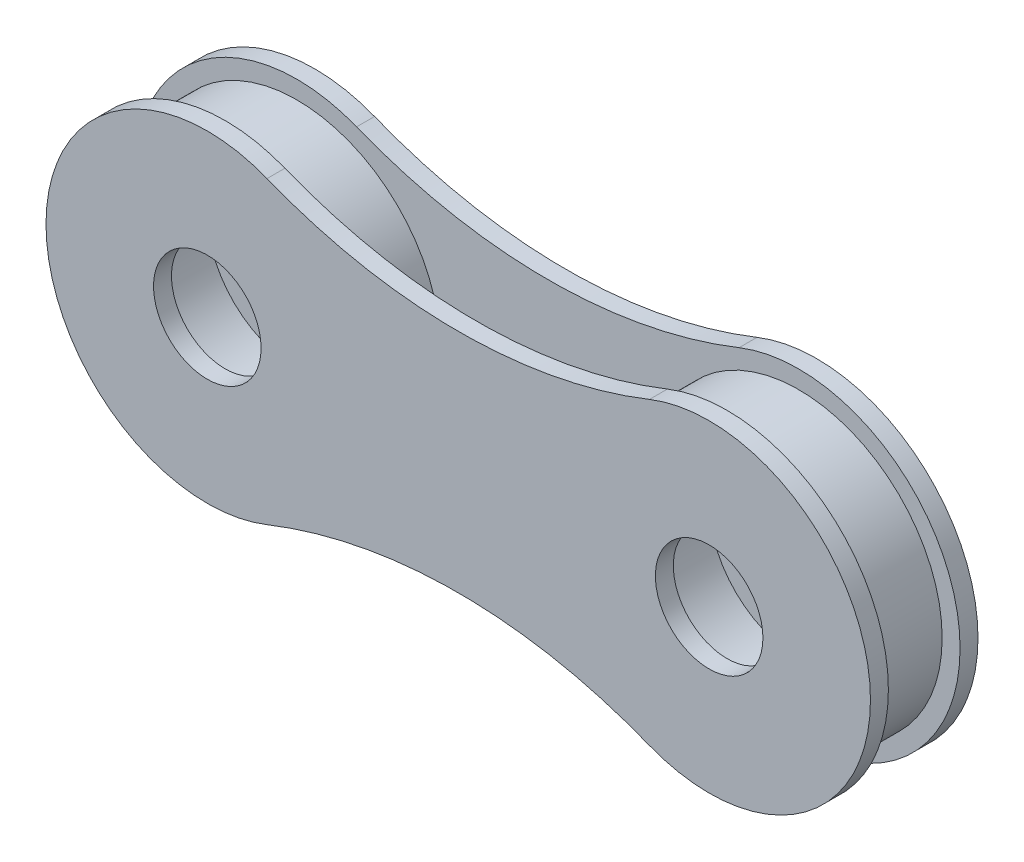
ISO-10303-21;
HEADER;
FILE_DESCRIPTION(('STEP AP214'),'2;1');
FILE_NAME('part.step','',(''),(''),'','','');
FILE_SCHEMA(('AUTOMOTIVE_DESIGN { 1 0 10303 214 1 1 1 1 }'));
ENDSEC;
DATA;
#1=APPLICATION_CONTEXT('core data for automotive mechanical design processes');
#2=APPLICATION_PROTOCOL_DEFINITION('international standard','automotive_design',2000,#1);
#3=PRODUCT_CONTEXT('',#1,'mechanical');
#4=PRODUCT('Part','Part','',(#3));
#5=PRODUCT_RELATED_PRODUCT_CATEGORY('part','',(#4));
#6=PRODUCT_DEFINITION_FORMATION('','',#4);
#7=PRODUCT_DEFINITION_CONTEXT('part definition',#1,'design');
#8=PRODUCT_DEFINITION('design','',#6,#7);
#9=PRODUCT_DEFINITION_SHAPE('','',#8);
#10=(LENGTH_UNIT() NAMED_UNIT(*) SI_UNIT(.MILLI.,.METRE.));
#11=(NAMED_UNIT(*) PLANE_ANGLE_UNIT() SI_UNIT($,.RADIAN.));
#12=(NAMED_UNIT(*) SI_UNIT($,.STERADIAN.) SOLID_ANGLE_UNIT());
#13=UNCERTAINTY_MEASURE_WITH_UNIT(LENGTH_MEASURE(1.E-05),#10,'distance_accuracy_value','');
#14=(GEOMETRIC_REPRESENTATION_CONTEXT(3) GLOBAL_UNCERTAINTY_ASSIGNED_CONTEXT((#13)) GLOBAL_UNIT_ASSIGNED_CONTEXT((#10,
#11,#12)) REPRESENTATION_CONTEXT('',''));
#15=CARTESIAN_POINT('',(0.,0.,0.));
#16=DIRECTION('',(0.,0.,1.));
#17=DIRECTION('',(1.,0.,0.));
#18=AXIS2_PLACEMENT_3D('',#15,#16,#17);
#19=CARTESIAN_POINT('',(-10.4421147734021,0.,1.));
#20=DIRECTION('',(0.,0.,-1.));
#21=DIRECTION('',(-1.,0.,0.));
#22=AXIS2_PLACEMENT_3D('',#19,#20,#21);
#23=CYLINDRICAL_SURFACE('',#22,4.);
#24=CARTESIAN_POINT('',(-10.4421147734021,0.,1.));
#25=DIRECTION('',(0.,0.,1.));
#26=DIRECTION('',(1.,0.,0.));
#27=AXIS2_PLACEMENT_3D('',#24,#25,#26);
#28=CIRCLE('',#27,4.);
#29=CARTESIAN_POINT('',(-6.44211477340213,0.,1.));
#30=VERTEX_POINT('',#29);
#31=EDGE_CURVE('E49',#30,#30,#28,.T.);
#32=ORIENTED_EDGE('',*,*,#31,.F.);
#33=EDGE_LOOP('',(#32));
#34=FACE_BOUND('',#33,.T.);
#35=CARTESIAN_POINT('',(-10.4421147734021,0.,-1.));
#36=DIRECTION('',(0.,0.,1.));
#37=DIRECTION('',(1.,0.,0.));
#38=AXIS2_PLACEMENT_3D('',#35,#36,#37);
#39=CIRCLE('',#38,4.);
#40=CARTESIAN_POINT('',(-6.44211477340213,0.,-1.));
#41=VERTEX_POINT('',#40);
#42=EDGE_CURVE('E183',#41,#41,#39,.T.);
#43=ORIENTED_EDGE('',*,*,#42,.T.);
#44=EDGE_LOOP('',(#43));
#45=FACE_BOUND('',#44,.T.);
#46=ADVANCED_FACE('F39',(#34,#45),#23,.T.);
#47=CARTESIAN_POINT('',(-3.44211477340213,17.5771390566533,1.5));
#48=DIRECTION('',(0.,0.,-1.));
#49=DIRECTION('',(-1.,0.,0.));
#50=AXIS2_PLACEMENT_3D('',#47,#48,#49);
#51=CYLINDRICAL_SURFACE('',#50,14.4197203313613);
#52=CARTESIAN_POINT('',(-3.44211477340213,17.5771390566533,1.));
#53=DIRECTION('',(0.,0.,-1.));
#54=DIRECTION('',(1.,0.,0.));
#55=AXIS2_PLACEMENT_3D('',#52,#53,#54);
#56=CIRCLE('',#55,14.4197203313613);
#57=CARTESIAN_POINT('',(1.89295575362962,4.18067098084048,1.));
#58=VERTEX_POINT('',#57);
#59=CARTESIAN_POINT('',(-8.77718530043389,4.18067098084048,1.));
#60=VERTEX_POINT('',#59);
#61=EDGE_CURVE('E178',#58,#60,#56,.T.);
#62=ORIENTED_EDGE('',*,*,#61,.T.);
#63=DIRECTION('',(0.,0.,-1.));
#64=VECTOR('',#63,1.);
#65=CARTESIAN_POINT('',(-8.77718530043389,4.18067098084048,1.5));
#66=LINE('',#65,#64);
#67=CARTESIAN_POINT('',(-8.77718530043389,4.18067098084048,1.5));
#68=VERTEX_POINT('',#67);
#69=EDGE_CURVE('E216',#68,#60,#66,.T.);
#70=ORIENTED_EDGE('',*,*,#69,.F.);
#71=CARTESIAN_POINT('',(-3.44211477340213,17.5771390566533,1.5));
#72=DIRECTION('',(0.,0.,-1.));
#73=DIRECTION('',(1.,0.,0.));
#74=AXIS2_PLACEMENT_3D('',#71,#72,#73);
#75=CIRCLE('',#74,14.4197203313613);
#76=CARTESIAN_POINT('',(1.89295575362962,4.18067098084048,1.5));
#77=VERTEX_POINT('',#76);
#78=EDGE_CURVE('E187',#77,#68,#75,.T.);
#79=ORIENTED_EDGE('',*,*,#78,.F.);
#80=DIRECTION('',(0.,0.,-1.));
#81=VECTOR('',#80,1.);
#82=CARTESIAN_POINT('',(1.89295575362962,4.18067098084048,1.5));
#83=LINE('',#82,#81);
#84=EDGE_CURVE('E197',#77,#58,#83,.T.);
#85=ORIENTED_EDGE('',*,*,#84,.T.);
#86=EDGE_LOOP('',(#62,#70,#79,#85));
#87=FACE_BOUND('',#86,.T.);
#88=ADVANCED_FACE('F287',(#87),#51,.F.);
#89=CARTESIAN_POINT('',(-10.4421147734021,0.,1.5));
#90=DIRECTION('',(0.,0.,-1.));
#91=DIRECTION('',(-1.,0.,0.));
#92=AXIS2_PLACEMENT_3D('',#89,#90,#91);
#93=CYLINDRICAL_SURFACE('',#92,4.5);
#94=CARTESIAN_POINT('',(-10.4421147734021,0.,1.));
#95=DIRECTION('',(0.,0.,1.));
#96=DIRECTION('',(1.,0.,0.));
#97=AXIS2_PLACEMENT_3D('',#94,#95,#96);
#98=CIRCLE('',#97,4.5);
#99=CARTESIAN_POINT('',(-8.77718530043389,-4.18067098084048,1.));
#100=VERTEX_POINT('',#99);
#101=EDGE_CURVE('E201',#60,#100,#98,.T.);
#102=ORIENTED_EDGE('',*,*,#101,.T.);
#103=DIRECTION('',(0.,0.,-1.));
#104=VECTOR('',#103,1.);
#105=CARTESIAN_POINT('',(-8.77718530043389,-4.18067098084048,1.5));
#106=LINE('',#105,#104);
#107=CARTESIAN_POINT('',(-8.77718530043389,-4.18067098084048,1.5));
#108=VERTEX_POINT('',#107);
#109=EDGE_CURVE('E213',#108,#100,#106,.T.);
#110=ORIENTED_EDGE('',*,*,#109,.F.);
#111=CARTESIAN_POINT('',(-10.4421147734021,0.,1.5));
#112=DIRECTION('',(0.,0.,1.));
#113=DIRECTION('',(1.,0.,0.));
#114=AXIS2_PLACEMENT_3D('',#111,#112,#113);
#115=CIRCLE('',#114,4.5);
#116=EDGE_CURVE('E90',#68,#108,#115,.T.);
#117=ORIENTED_EDGE('',*,*,#116,.F.);
#118=ORIENTED_EDGE('',*,*,#69,.T.);
#119=EDGE_LOOP('',(#102,#110,#117,#118));
#120=FACE_BOUND('',#119,.T.);
#121=ADVANCED_FACE('F292',(#120),#93,.T.);
#122=CARTESIAN_POINT('',(-3.44211477340213,-17.5771390566533,1.5));
#123=DIRECTION('',(0.,0.,-1.));
#124=DIRECTION('',(-1.,0.,0.));
#125=AXIS2_PLACEMENT_3D('',#122,#123,#124);
#126=CYLINDRICAL_SURFACE('',#125,14.4197203313613);
#127=CARTESIAN_POINT('',(-3.44211477340213,-17.5771390566533,1.));
#128=DIRECTION('',(0.,0.,-1.));
#129=DIRECTION('',(-1.,0.,0.));
#130=AXIS2_PLACEMENT_3D('',#127,#128,#129);
#131=CIRCLE('',#130,14.4197203313613);
#132=CARTESIAN_POINT('',(1.89295575362962,-4.18067098084048,1.));
#133=VERTEX_POINT('',#132);
#134=EDGE_CURVE('E76',#100,#133,#131,.T.);
#135=ORIENTED_EDGE('',*,*,#134,.T.);
#136=DIRECTION('',(0.,0.,-1.));
#137=VECTOR('',#136,1.);
#138=CARTESIAN_POINT('',(1.89295575362962,-4.18067098084048,1.5));
#139=LINE('',#138,#137);
#140=CARTESIAN_POINT('',(1.89295575362962,-4.18067098084048,1.5));
#141=VERTEX_POINT('',#140);
#142=EDGE_CURVE('E210',#141,#133,#139,.T.);
#143=ORIENTED_EDGE('',*,*,#142,.F.);
#144=CARTESIAN_POINT('',(-3.44211477340213,-17.5771390566533,1.5));
#145=DIRECTION('',(0.,0.,-1.));
#146=DIRECTION('',(-1.,0.,0.));
#147=AXIS2_PLACEMENT_3D('',#144,#145,#146);
#148=CIRCLE('',#147,14.4197203313613);
#149=EDGE_CURVE('E192',#108,#141,#148,.T.);
#150=ORIENTED_EDGE('',*,*,#149,.F.);
#151=ORIENTED_EDGE('',*,*,#109,.T.);
#152=EDGE_LOOP('',(#135,#143,#150,#151));
#153=FACE_BOUND('',#152,.T.);
#154=ADVANCED_FACE('F343',(#153),#126,.F.);
#155=CARTESIAN_POINT('',(3.55788522659787,0.,1.5));
#156=DIRECTION('',(0.,0.,-1.));
#157=DIRECTION('',(-1.,0.,0.));
#158=AXIS2_PLACEMENT_3D('',#155,#156,#157);
#159=CYLINDRICAL_SURFACE('',#158,4.5);
#160=CARTESIAN_POINT('',(3.55788522659787,0.,1.));
#161=DIRECTION('',(0.,0.,1.));
#162=DIRECTION('',(1.,0.,0.));
#163=AXIS2_PLACEMENT_3D('',#160,#161,#162);
#164=CIRCLE('',#163,4.5);
#165=EDGE_CURVE('E82',#133,#58,#164,.T.);
#166=ORIENTED_EDGE('',*,*,#165,.T.);
#167=ORIENTED_EDGE('',*,*,#84,.F.);
#168=CARTESIAN_POINT('',(3.55788522659787,0.,1.5));
#169=DIRECTION('',(0.,0.,1.));
#170=DIRECTION('',(1.,0.,0.));
#171=AXIS2_PLACEMENT_3D('',#168,#169,#170);
#172=CIRCLE('',#171,4.5);
#173=EDGE_CURVE('E58',#141,#77,#172,.T.);
#174=ORIENTED_EDGE('',*,*,#173,.F.);
#175=ORIENTED_EDGE('',*,*,#142,.T.);
#176=EDGE_LOOP('',(#166,#167,#174,#175));
#177=FACE_BOUND('',#176,.T.);
#178=ADVANCED_FACE('F335',(#177),#159,.T.);
#179=CARTESIAN_POINT('',(0.0578852265978674,8.78856952832666,1.5));
#180=DIRECTION('',(0.,0.,1.));
#181=DIRECTION('',(1.,0.,0.));
#182=AXIS2_PLACEMENT_3D('',#179,#180,#181);
#183=PLANE('',#182);
#184=CARTESIAN_POINT('',(-10.4421147734021,0.,1.5));
#185=DIRECTION('',(0.,0.,1.));
#186=DIRECTION('',(1.,0.,0.));
#187=AXIS2_PLACEMENT_3D('',#184,#185,#186);
#188=CIRCLE('',#187,1.5);
#189=CARTESIAN_POINT('',(-8.94211477340213,0.,1.5));
#190=VERTEX_POINT('',#189);
#191=EDGE_CURVE('E244',#190,#190,#188,.T.);
#192=ORIENTED_EDGE('',*,*,#191,.F.);
#193=EDGE_LOOP('',(#192));
#194=FACE_BOUND('',#193,.T.);
#195=CARTESIAN_POINT('',(3.55788522659787,0.,1.5));
#196=DIRECTION('',(0.,0.,1.));
#197=DIRECTION('',(1.,0.,0.));
#198=AXIS2_PLACEMENT_3D('',#195,#196,#197);
#199=CIRCLE('',#198,1.5);
#200=CARTESIAN_POINT('',(5.05788522659787,0.,1.5));
#201=VERTEX_POINT('',#200);
#202=EDGE_CURVE('E253',#201,#201,#199,.T.);
#203=ORIENTED_EDGE('',*,*,#202,.F.);
#204=EDGE_LOOP('',(#203));
#205=FACE_BOUND('',#204,.T.);
#206=ORIENTED_EDGE('',*,*,#78,.T.);
#207=ORIENTED_EDGE('',*,*,#116,.T.);
#208=ORIENTED_EDGE('',*,*,#149,.T.);
#209=ORIENTED_EDGE('',*,*,#173,.T.);
#210=EDGE_LOOP('',(#206,#207,#208,#209));
#211=FACE_BOUND('',#210,.T.);
#212=ADVANCED_FACE('F332',(#194,#205,#211),#183,.T.);
#213=CARTESIAN_POINT('',(0.0578852265978674,8.78856952832666,1.));
#214=DIRECTION('',(0.,0.,1.));
#215=DIRECTION('',(1.,0.,0.));
#216=AXIS2_PLACEMENT_3D('',#213,#214,#215);
#217=PLANE('',#216);
#218=CARTESIAN_POINT('',(3.55788522659787,0.,1.));
#219=DIRECTION('',(0.,0.,1.));
#220=DIRECTION('',(1.,0.,0.));
#221=AXIS2_PLACEMENT_3D('',#218,#219,#220);
#222=CIRCLE('',#221,4.);
#223=CARTESIAN_POINT('',(7.55788522659787,0.,1.));
#224=VERTEX_POINT('',#223);
#225=EDGE_CURVE('E11',#224,#224,#222,.F.);
#226=ORIENTED_EDGE('',*,*,#225,.F.);
#227=EDGE_LOOP('',(#226));
#228=FACE_BOUND('',#227,.T.);
#229=ORIENTED_EDGE('',*,*,#31,.T.);
#230=EDGE_LOOP('',(#229));
#231=FACE_BOUND('',#230,.T.);
#232=ORIENTED_EDGE('',*,*,#61,.F.);
#233=ORIENTED_EDGE('',*,*,#165,.F.);
#234=ORIENTED_EDGE('',*,*,#134,.F.);
#235=ORIENTED_EDGE('',*,*,#101,.F.);
#236=EDGE_LOOP('',(#232,#233,#234,#235));
#237=FACE_BOUND('',#236,.T.);
#238=ADVANCED_FACE('F330',(#228,#231,#237),#217,.F.);
#239=CARTESIAN_POINT('',(3.55788522659787,0.,1.));
#240=DIRECTION('',(0.,0.,-1.));
#241=DIRECTION('',(-1.,0.,0.));
#242=AXIS2_PLACEMENT_3D('',#239,#240,#241);
#243=CYLINDRICAL_SURFACE('',#242,4.);
#244=ORIENTED_EDGE('',*,*,#225,.T.);
#245=EDGE_LOOP('',(#244));
#246=FACE_BOUND('',#245,.T.);
#247=CARTESIAN_POINT('',(3.55788522659787,0.,-1.));
#248=DIRECTION('',(0.,0.,1.));
#249=DIRECTION('',(1.,0.,0.));
#250=AXIS2_PLACEMENT_3D('',#247,#248,#249);
#251=CIRCLE('',#250,4.);
#252=CARTESIAN_POINT('',(7.55788522659787,0.,-1.));
#253=VERTEX_POINT('',#252);
#254=EDGE_CURVE('E129',#253,#253,#251,.T.);
#255=ORIENTED_EDGE('',*,*,#254,.T.);
#256=EDGE_LOOP('',(#255));
#257=FACE_BOUND('',#256,.T.);
#258=ADVANCED_FACE('F302',(#246,#257),#243,.T.);
#259=CARTESIAN_POINT('',(0.0578852265978674,8.78856952832666,-1.));
#260=DIRECTION('',(0.,0.,-1.));
#261=DIRECTION('',(1.,0.,0.));
#262=AXIS2_PLACEMENT_3D('',#259,#260,#261);
#263=PLANE('',#262);
#264=ORIENTED_EDGE('',*,*,#42,.F.);
#265=EDGE_LOOP('',(#264));
#266=FACE_BOUND('',#265,.T.);
#267=ORIENTED_EDGE('',*,*,#254,.F.);
#268=EDGE_LOOP('',(#267));
#269=FACE_BOUND('',#268,.T.);
#270=CARTESIAN_POINT('',(-3.44211477340213,17.5771390566533,-1.));
#271=DIRECTION('',(0.,0.,-1.));
#272=DIRECTION('',(1.,0.,0.));
#273=AXIS2_PLACEMENT_3D('',#270,#271,#272);
#274=CIRCLE('',#273,14.4197203313613);
#275=CARTESIAN_POINT('',(1.89295575362962,4.18067098084048,-1.));
#276=VERTEX_POINT('',#275);
#277=CARTESIAN_POINT('',(-8.77718530043389,4.18067098084048,-1.));
#278=VERTEX_POINT('',#277);
#279=EDGE_CURVE('E123',#276,#278,#274,.T.);
#280=ORIENTED_EDGE('',*,*,#279,.T.);
#281=CARTESIAN_POINT('',(-10.4421147734021,0.,-1.));
#282=DIRECTION('',(0.,0.,1.));
#283=DIRECTION('',(1.,0.,0.));
#284=AXIS2_PLACEMENT_3D('',#281,#282,#283);
#285=CIRCLE('',#284,4.5);
#286=CARTESIAN_POINT('',(-8.77718530043389,-4.18067098084048,-1.));
#287=VERTEX_POINT('',#286);
#288=EDGE_CURVE('E141',#278,#287,#285,.T.);
#289=ORIENTED_EDGE('',*,*,#288,.T.);
#290=CARTESIAN_POINT('',(-3.44211477340213,-17.5771390566533,-1.));
#291=DIRECTION('',(0.,0.,-1.));
#292=DIRECTION('',(-1.,0.,0.));
#293=AXIS2_PLACEMENT_3D('',#290,#291,#292);
#294=CIRCLE('',#293,14.4197203313613);
#295=CARTESIAN_POINT('',(1.89295575362962,-4.18067098084048,-1.));
#296=VERTEX_POINT('',#295);
#297=EDGE_CURVE('E160',#287,#296,#294,.T.);
#298=ORIENTED_EDGE('',*,*,#297,.T.);
#299=CARTESIAN_POINT('',(3.55788522659787,0.,-1.));
#300=DIRECTION('',(0.,0.,1.));
#301=DIRECTION('',(1.,0.,0.));
#302=AXIS2_PLACEMENT_3D('',#299,#300,#301);
#303=CIRCLE('',#302,4.5);
#304=EDGE_CURVE('E156',#296,#276,#303,.T.);
#305=ORIENTED_EDGE('',*,*,#304,.T.);
#306=EDGE_LOOP('',(#280,#289,#298,#305));
#307=FACE_BOUND('',#306,.T.);
#308=ADVANCED_FACE('F299',(#266,#269,#307),#263,.F.);
#309=CARTESIAN_POINT('',(0.0578852265978674,8.78856952832666,-1.5));
#310=DIRECTION('',(0.,0.,-1.));
#311=DIRECTION('',(1.,0.,0.));
#312=AXIS2_PLACEMENT_3D('',#309,#310,#311);
#313=PLANE('',#312);
#314=CARTESIAN_POINT('',(-10.4421147734021,0.,-1.5));
#315=DIRECTION('',(0.,0.,1.));
#316=DIRECTION('',(1.,0.,0.));
#317=AXIS2_PLACEMENT_3D('',#314,#315,#316);
#318=CIRCLE('',#317,1.5);
#319=CARTESIAN_POINT('',(-8.94211477340213,0.,-1.5));
#320=VERTEX_POINT('',#319);
#321=EDGE_CURVE('E236',#320,#320,#318,.T.);
#322=ORIENTED_EDGE('',*,*,#321,.T.);
#323=EDGE_LOOP('',(#322));
#324=FACE_BOUND('',#323,.T.);
#325=CARTESIAN_POINT('',(3.55788522659787,0.,-1.5));
#326=DIRECTION('',(0.,0.,1.));
#327=DIRECTION('',(1.,0.,0.));
#328=AXIS2_PLACEMENT_3D('',#325,#326,#327);
#329=CIRCLE('',#328,1.5);
#330=CARTESIAN_POINT('',(5.05788522659787,0.,-1.5));
#331=VERTEX_POINT('',#330);
#332=EDGE_CURVE('E250',#331,#331,#329,.T.);
#333=ORIENTED_EDGE('',*,*,#332,.T.);
#334=EDGE_LOOP('',(#333));
#335=FACE_BOUND('',#334,.T.);
#336=CARTESIAN_POINT('',(-3.44211477340213,17.5771390566533,-1.5));
#337=DIRECTION('',(0.,0.,-1.));
#338=DIRECTION('',(1.,0.,0.));
#339=AXIS2_PLACEMENT_3D('',#336,#337,#338);
#340=CIRCLE('',#339,14.4197203313613);
#341=CARTESIAN_POINT('',(1.89295575362962,4.18067098084048,-1.5));
#342=VERTEX_POINT('',#341);
#343=CARTESIAN_POINT('',(-8.77718530043389,4.18067098084048,-1.5));
#344=VERTEX_POINT('',#343);
#345=EDGE_CURVE('E120',#342,#344,#340,.T.);
#346=ORIENTED_EDGE('',*,*,#345,.F.);
#347=CARTESIAN_POINT('',(3.55788522659787,0.,-1.5));
#348=DIRECTION('',(0.,0.,1.));
#349=DIRECTION('',(1.,0.,0.));
#350=AXIS2_PLACEMENT_3D('',#347,#348,#349);
#351=CIRCLE('',#350,4.5);
#352=CARTESIAN_POINT('',(1.89295575362962,-4.18067098084048,-1.5));
#353=VERTEX_POINT('',#352);
#354=EDGE_CURVE('E136',#353,#342,#351,.T.);
#355=ORIENTED_EDGE('',*,*,#354,.F.);
#356=CARTESIAN_POINT('',(-3.44211477340213,-17.5771390566533,-1.5));
#357=DIRECTION('',(0.,0.,-1.));
#358=DIRECTION('',(-1.,0.,0.));
#359=AXIS2_PLACEMENT_3D('',#356,#357,#358);
#360=CIRCLE('',#359,14.4197203313613);
#361=CARTESIAN_POINT('',(-8.77718530043389,-4.18067098084048,-1.5));
#362=VERTEX_POINT('',#361);
#363=EDGE_CURVE('E145',#362,#353,#360,.T.);
#364=ORIENTED_EDGE('',*,*,#363,.F.);
#365=CARTESIAN_POINT('',(-10.4421147734021,0.,-1.5));
#366=DIRECTION('',(0.,0.,1.));
#367=DIRECTION('',(1.,0.,0.));
#368=AXIS2_PLACEMENT_3D('',#365,#366,#367);
#369=CIRCLE('',#368,4.5);
#370=EDGE_CURVE('E139',#344,#362,#369,.T.);
#371=ORIENTED_EDGE('',*,*,#370,.F.);
#372=EDGE_LOOP('',(#346,#355,#364,#371));
#373=FACE_BOUND('',#372,.T.);
#374=ADVANCED_FACE('F134',(#324,#335,#373),#313,.T.);
#375=CARTESIAN_POINT('',(-10.4421147734021,0.,-1.5));
#376=DIRECTION('',(0.,0.,1.));
#377=DIRECTION('',(1.,0.,0.));
#378=AXIS2_PLACEMENT_3D('',#375,#376,#377);
#379=CYLINDRICAL_SURFACE('',#378,4.5);
#380=ORIENTED_EDGE('',*,*,#288,.F.);
#381=DIRECTION('',(0.,0.,1.));
#382=VECTOR('',#381,1.);
#383=CARTESIAN_POINT('',(-8.77718530043389,4.18067098084048,-1.5));
#384=LINE('',#383,#382);
#385=EDGE_CURVE('E153',#344,#278,#384,.T.);
#386=ORIENTED_EDGE('',*,*,#385,.F.);
#387=ORIENTED_EDGE('',*,*,#370,.T.);
#388=DIRECTION('',(0.,0.,1.));
#389=VECTOR('',#388,1.);
#390=CARTESIAN_POINT('',(-8.77718530043389,-4.18067098084048,-1.5));
#391=LINE('',#390,#389);
#392=EDGE_CURVE('E169',#362,#287,#391,.T.);
#393=ORIENTED_EDGE('',*,*,#392,.T.);
#394=EDGE_LOOP('',(#380,#386,#387,#393));
#395=FACE_BOUND('',#394,.T.);
#396=ADVANCED_FACE('F309',(#395),#379,.T.);
#397=CARTESIAN_POINT('',(-3.44211477340213,-17.5771390566533,-1.5));
#398=DIRECTION('',(0.,0.,1.));
#399=DIRECTION('',(1.,0.,0.));
#400=AXIS2_PLACEMENT_3D('',#397,#398,#399);
#401=CYLINDRICAL_SURFACE('',#400,14.4197203313613);
#402=ORIENTED_EDGE('',*,*,#297,.F.);
#403=ORIENTED_EDGE('',*,*,#392,.F.);
#404=ORIENTED_EDGE('',*,*,#363,.T.);
#405=DIRECTION('',(0.,0.,1.));
#406=VECTOR('',#405,1.);
#407=CARTESIAN_POINT('',(1.89295575362962,-4.18067098084048,-1.5));
#408=LINE('',#407,#406);
#409=EDGE_CURVE('E130',#353,#296,#408,.T.);
#410=ORIENTED_EDGE('',*,*,#409,.T.);
#411=EDGE_LOOP('',(#402,#403,#404,#410));
#412=FACE_BOUND('',#411,.T.);
#413=ADVANCED_FACE('F312',(#412),#401,.F.);
#414=CARTESIAN_POINT('',(3.55788522659787,0.,-1.5));
#415=DIRECTION('',(0.,0.,1.));
#416=DIRECTION('',(1.,0.,0.));
#417=AXIS2_PLACEMENT_3D('',#414,#415,#416);
#418=CYLINDRICAL_SURFACE('',#417,4.5);
#419=ORIENTED_EDGE('',*,*,#304,.F.);
#420=ORIENTED_EDGE('',*,*,#409,.F.);
#421=ORIENTED_EDGE('',*,*,#354,.T.);
#422=DIRECTION('',(0.,0.,1.));
#423=VECTOR('',#422,1.);
#424=CARTESIAN_POINT('',(1.89295575362962,4.18067098084048,-1.5));
#425=LINE('',#424,#423);
#426=EDGE_CURVE('E117',#342,#276,#425,.T.);
#427=ORIENTED_EDGE('',*,*,#426,.T.);
#428=EDGE_LOOP('',(#419,#420,#421,#427));
#429=FACE_BOUND('',#428,.T.);
#430=ADVANCED_FACE('F143',(#429),#418,.T.);
#431=CARTESIAN_POINT('',(-3.44211477340213,17.5771390566533,-1.5));
#432=DIRECTION('',(0.,0.,1.));
#433=DIRECTION('',(1.,0.,0.));
#434=AXIS2_PLACEMENT_3D('',#431,#432,#433);
#435=CYLINDRICAL_SURFACE('',#434,14.4197203313613);
#436=ORIENTED_EDGE('',*,*,#279,.F.);
#437=ORIENTED_EDGE('',*,*,#426,.F.);
#438=ORIENTED_EDGE('',*,*,#345,.T.);
#439=ORIENTED_EDGE('',*,*,#385,.T.);
#440=EDGE_LOOP('',(#436,#437,#438,#439));
#441=FACE_BOUND('',#440,.T.);
#442=ADVANCED_FACE('F119',(#441),#435,.F.);
#443=CARTESIAN_POINT('',(-10.4421147734021,0.,-1.5));
#444=DIRECTION('',(0.,0.,1.));
#445=DIRECTION('',(1.,0.,0.));
#446=AXIS2_PLACEMENT_3D('',#443,#444,#445);
#447=CYLINDRICAL_SURFACE('',#446,1.5);
#448=ORIENTED_EDGE('',*,*,#191,.T.);
#449=EDGE_LOOP('',(#448));
#450=FACE_BOUND('',#449,.T.);
#451=CARTESIAN_POINT('',(-10.4421147734021,0.,1.));
#452=DIRECTION('',(0.,0.,1.));
#453=DIRECTION('',(1.,0.,0.));
#454=AXIS2_PLACEMENT_3D('',#451,#452,#453);
#455=CIRCLE('',#454,1.5);
#456=CARTESIAN_POINT('',(-8.94211477340213,0.,1.));
#457=VERTEX_POINT('',#456);
#458=EDGE_CURVE('E232',#457,#457,#455,.T.);
#459=ORIENTED_EDGE('',*,*,#458,.F.);
#460=EDGE_LOOP('',(#459));
#461=FACE_BOUND('',#460,.T.);
#462=ADVANCED_FACE('F282',(#450,#461),#447,.F.);
#463=ORIENTED_EDGE('',*,*,#321,.F.);
#464=EDGE_LOOP('',(#463));
#465=FACE_BOUND('',#464,.T.);
#466=CARTESIAN_POINT('',(-10.4421147734021,0.,-1.));
#467=DIRECTION('',(0.,0.,-1.));
#468=DIRECTION('',(-1.,0.,0.));
#469=AXIS2_PLACEMENT_3D('',#466,#467,#468);
#470=CIRCLE('',#469,1.5);
#471=CARTESIAN_POINT('',(-11.9421147734021,0.,-1.));
#472=VERTEX_POINT('',#471);
#473=EDGE_CURVE('E235',#472,#472,#470,.T.);
#474=ORIENTED_EDGE('',*,*,#473,.F.);
#475=EDGE_LOOP('',(#474));
#476=FACE_BOUND('',#475,.T.);
#477=ADVANCED_FACE('F273',(#465,#476),#447,.F.);
#478=CARTESIAN_POINT('',(3.55788522659787,0.,-1.5));
#479=DIRECTION('',(0.,0.,1.));
#480=DIRECTION('',(1.,0.,0.));
#481=AXIS2_PLACEMENT_3D('',#478,#479,#480);
#482=CYLINDRICAL_SURFACE('',#481,1.5);
#483=ORIENTED_EDGE('',*,*,#202,.T.);
#484=EDGE_LOOP('',(#483));
#485=FACE_BOUND('',#484,.T.);
#486=CARTESIAN_POINT('',(3.55788522659787,0.,1.));
#487=DIRECTION('',(0.,0.,1.));
#488=DIRECTION('',(1.,0.,0.));
#489=AXIS2_PLACEMENT_3D('',#486,#487,#488);
#490=CIRCLE('',#489,1.5);
#491=CARTESIAN_POINT('',(5.05788522659787,0.,1.));
#492=VERTEX_POINT('',#491);
#493=EDGE_CURVE('E42',#492,#492,#490,.T.);
#494=ORIENTED_EDGE('',*,*,#493,.F.);
#495=EDGE_LOOP('',(#494));
#496=FACE_BOUND('',#495,.T.);
#497=ADVANCED_FACE('F270',(#485,#496),#482,.F.);
#498=ORIENTED_EDGE('',*,*,#332,.F.);
#499=EDGE_LOOP('',(#498));
#500=FACE_BOUND('',#499,.T.);
#501=CARTESIAN_POINT('',(3.55788522659787,0.,-1.));
#502=DIRECTION('',(0.,0.,-1.));
#503=DIRECTION('',(-1.,0.,0.));
#504=AXIS2_PLACEMENT_3D('',#501,#502,#503);
#505=CIRCLE('',#504,1.5);
#506=CARTESIAN_POINT('',(2.05788522659787,0.,-1.));
#507=VERTEX_POINT('',#506);
#508=EDGE_CURVE('E157',#507,#507,#505,.T.);
#509=ORIENTED_EDGE('',*,*,#508,.F.);
#510=EDGE_LOOP('',(#509));
#511=FACE_BOUND('',#510,.T.);
#512=ADVANCED_FACE('F272',(#500,#511),#482,.F.);
#513=ORIENTED_EDGE('',*,*,#473,.T.);
#514=EDGE_LOOP('',(#513));
#515=FACE_BOUND('',#514,.T.);
#516=CARTESIAN_POINT('',(-10.4421147734021,0.,-1.));
#517=DIRECTION('',(0.,0.,1.));
#518=DIRECTION('',(1.,0.,0.));
#519=AXIS2_PLACEMENT_3D('',#516,#517,#518);
#520=CIRCLE('',#519,2.5);
#521=CARTESIAN_POINT('',(-7.94211477340213,0.,-1.));
#522=VERTEX_POINT('',#521);
#523=EDGE_CURVE('E223',#522,#522,#520,.T.);
#524=ORIENTED_EDGE('',*,*,#523,.T.);
#525=EDGE_LOOP('',(#524));
#526=FACE_BOUND('',#525,.T.);
#527=ADVANCED_FACE('F280',(#515,#526),#263,.F.);
#528=ORIENTED_EDGE('',*,*,#458,.T.);
#529=EDGE_LOOP('',(#528));
#530=FACE_BOUND('',#529,.T.);
#531=CARTESIAN_POINT('',(-10.4421147734021,0.,1.));
#532=DIRECTION('',(0.,0.,1.));
#533=DIRECTION('',(1.,0.,0.));
#534=AXIS2_PLACEMENT_3D('',#531,#532,#533);
#535=CIRCLE('',#534,2.5);
#536=CARTESIAN_POINT('',(-7.94211477340213,0.,1.));
#537=VERTEX_POINT('',#536);
#538=EDGE_CURVE('E219',#537,#537,#535,.T.);
#539=ORIENTED_EDGE('',*,*,#538,.F.);
#540=EDGE_LOOP('',(#539));
#541=FACE_BOUND('',#540,.T.);
#542=ADVANCED_FACE('F340',(#530,#541),#217,.F.);
#543=CARTESIAN_POINT('',(-10.4421147734021,0.,1.));
#544=DIRECTION('',(0.,0.,-1.));
#545=DIRECTION('',(-1.,0.,0.));
#546=AXIS2_PLACEMENT_3D('',#543,#544,#545);
#547=CYLINDRICAL_SURFACE('',#546,2.5);
#548=ORIENTED_EDGE('',*,*,#538,.T.);
#549=EDGE_LOOP('',(#548));
#550=FACE_BOUND('',#549,.T.);
#551=ORIENTED_EDGE('',*,*,#523,.F.);
#552=EDGE_LOOP('',(#551));
#553=FACE_BOUND('',#552,.T.);
#554=ADVANCED_FACE('F347',(#550,#553),#547,.F.);
#555=ORIENTED_EDGE('',*,*,#508,.T.);
#556=EDGE_LOOP('',(#555));
#557=FACE_BOUND('',#556,.T.);
#558=CARTESIAN_POINT('',(3.55788522659787,0.,-1.));
#559=DIRECTION('',(0.,0.,1.));
#560=DIRECTION('',(1.,0.,0.));
#561=AXIS2_PLACEMENT_3D('',#558,#559,#560);
#562=CIRCLE('',#561,2.5);
#563=CARTESIAN_POINT('',(6.05788522659787,0.,-1.));
#564=VERTEX_POINT('',#563);
#565=EDGE_CURVE('E179',#564,#564,#562,.T.);
#566=ORIENTED_EDGE('',*,*,#565,.T.);
#567=EDGE_LOOP('',(#566));
#568=FACE_BOUND('',#567,.T.);
#569=ADVANCED_FACE('F304',(#557,#568),#263,.F.);
#570=ORIENTED_EDGE('',*,*,#493,.T.);
#571=EDGE_LOOP('',(#570));
#572=FACE_BOUND('',#571,.T.);
#573=CARTESIAN_POINT('',(3.55788522659787,0.,1.));
#574=DIRECTION('',(0.,0.,1.));
#575=DIRECTION('',(1.,0.,0.));
#576=AXIS2_PLACEMENT_3D('',#573,#574,#575);
#577=CIRCLE('',#576,2.5);
#578=CARTESIAN_POINT('',(6.05788522659787,0.,1.));
#579=VERTEX_POINT('',#578);
#580=EDGE_CURVE('E174',#579,#579,#577,.T.);
#581=ORIENTED_EDGE('',*,*,#580,.F.);
#582=EDGE_LOOP('',(#581));
#583=FACE_BOUND('',#582,.T.);
#584=ADVANCED_FACE('F267',(#572,#583),#217,.F.);
#585=CARTESIAN_POINT('',(3.55788522659787,0.,1.));
#586=DIRECTION('',(0.,0.,-1.));
#587=DIRECTION('',(-1.,0.,0.));
#588=AXIS2_PLACEMENT_3D('',#585,#586,#587);
#589=CYLINDRICAL_SURFACE('',#588,2.5);
#590=ORIENTED_EDGE('',*,*,#580,.T.);
#591=EDGE_LOOP('',(#590));
#592=FACE_BOUND('',#591,.T.);
#593=ORIENTED_EDGE('',*,*,#565,.F.);
#594=EDGE_LOOP('',(#593));
#595=FACE_BOUND('',#594,.T.);
#596=ADVANCED_FACE('F324',(#592,#595),#589,.F.);
#597=CLOSED_SHELL('',(#46,#88,#121,#154,#178,#212,#238,#258,#308,#374,#396,#413,#430,#442,#462,
#477,#497,#512,#527,#542,#554,#569,#584,#596));
#598=MANIFOLD_SOLID_BREP('B2',#597);
#599=ADVANCED_BREP_SHAPE_REPRESENTATION('',(#18,#598),#14);
#600=SHAPE_DEFINITION_REPRESENTATION(#9,#599);
ENDSEC;
END-ISO-10303-21;
